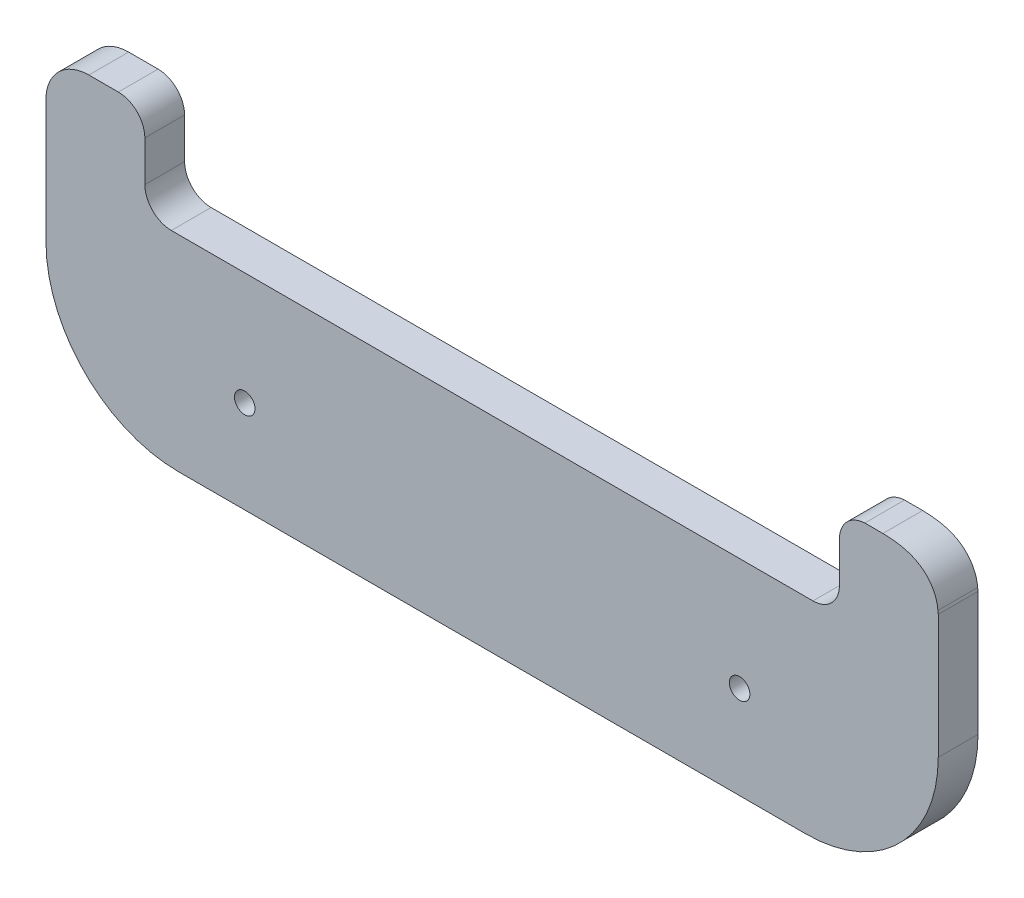
ISO-10303-21;
HEADER;
FILE_DESCRIPTION(('STEP AP214'),'2;1');
FILE_NAME('part.step','',(''),(''),'','','');
FILE_SCHEMA(('AUTOMOTIVE_DESIGN { 1 0 10303 214 1 1 1 1 }'));
ENDSEC;
DATA;
#1=APPLICATION_CONTEXT('core data for automotive mechanical design processes');
#2=APPLICATION_PROTOCOL_DEFINITION('international standard','automotive_design',2000,#1);
#3=PRODUCT_CONTEXT('',#1,'mechanical');
#4=PRODUCT('Part','Part','',(#3));
#5=PRODUCT_RELATED_PRODUCT_CATEGORY('part','',(#4));
#6=PRODUCT_DEFINITION_FORMATION('','',#4);
#7=PRODUCT_DEFINITION_CONTEXT('part definition',#1,'design');
#8=PRODUCT_DEFINITION('design','',#6,#7);
#9=PRODUCT_DEFINITION_SHAPE('','',#8);
#10=(LENGTH_UNIT() NAMED_UNIT(*) SI_UNIT(.MILLI.,.METRE.));
#11=(NAMED_UNIT(*) PLANE_ANGLE_UNIT() SI_UNIT($,.RADIAN.));
#12=(NAMED_UNIT(*) SI_UNIT($,.STERADIAN.) SOLID_ANGLE_UNIT());
#13=UNCERTAINTY_MEASURE_WITH_UNIT(LENGTH_MEASURE(1.E-05),#10,'distance_accuracy_value','');
#14=(GEOMETRIC_REPRESENTATION_CONTEXT(3) GLOBAL_UNCERTAINTY_ASSIGNED_CONTEXT((#13)) GLOBAL_UNIT_ASSIGNED_CONTEXT((#10,
#11,#12)) REPRESENTATION_CONTEXT('',''));
#15=CARTESIAN_POINT('',(0.,0.,0.));
#16=DIRECTION('',(0.,0.,1.));
#17=DIRECTION('',(1.,0.,0.));
#18=AXIS2_PLACEMENT_3D('',#15,#16,#17);
#19=CARTESIAN_POINT('',(559.303105379812,-401.196233577144,6.));
#20=DIRECTION('',(0.,1.,0.));
#21=DIRECTION('',(0.,0.,1.));
#22=AXIS2_PLACEMENT_3D('',#19,#20,#21);
#23=PLANE('',#22);
#24=DIRECTION('',(0.,0.,1.));
#25=VECTOR('',#24,1.);
#26=CARTESIAN_POINT('',(676.433614040021,-401.196233577144,0.));
#27=LINE('',#26,#25);
#28=CARTESIAN_POINT('',(676.433614040021,-401.196233577144,6.));
#29=VERTEX_POINT('',#28);
#30=CARTESIAN_POINT('',(676.433614040021,-401.196233577144,0.));
#31=VERTEX_POINT('',#30);
#32=EDGE_CURVE('E210',#29,#31,#27,.F.);
#33=ORIENTED_EDGE('',*,*,#32,.F.);
#34=DIRECTION('',(1.,0.,0.));
#35=VECTOR('',#34,1.);
#36=CARTESIAN_POINT('',(559.303105379812,-401.196233577144,6.));
#37=LINE('',#36,#35);
#38=CARTESIAN_POINT('',(679.169206808018,-401.196233577143,6.));
#39=VERTEX_POINT('',#38);
#40=EDGE_CURVE('E146',#29,#39,#37,.T.);
#41=ORIENTED_EDGE('',*,*,#40,.T.);
#42=DIRECTION('',(0.,0.,-1.));
#43=VECTOR('',#42,1.);
#44=CARTESIAN_POINT('',(679.169206808018,-401.196233577143,6.));
#45=LINE('',#44,#43);
#46=CARTESIAN_POINT('',(679.169206808018,-401.196233577143,0.));
#47=VERTEX_POINT('',#46);
#48=EDGE_CURVE('E48',#39,#47,#45,.T.);
#49=ORIENTED_EDGE('',*,*,#48,.T.);
#50=DIRECTION('',(1.,0.,0.));
#51=VECTOR('',#50,1.);
#52=CARTESIAN_POINT('',(559.303105379812,-401.196233577144,0.));
#53=LINE('',#52,#51);
#54=EDGE_CURVE('E213',#31,#47,#53,.T.);
#55=ORIENTED_EDGE('',*,*,#54,.F.);
#56=EDGE_LOOP('',(#33,#41,#49,#55));
#57=FACE_BOUND('',#56,.T.);
#58=ADVANCED_FACE('F39',(#57),#23,.T.);
#59=CARTESIAN_POINT('',(687.474491850152,-407.105172622809,6.));
#60=DIRECTION('',(0.994761891683852,0.102219268504351,0.));
#61=DIRECTION('',(-0.102219268504351,0.994761891683852,0.));
#62=AXIS2_PLACEMENT_3D('',#59,#60,#61);
#63=PLANE('',#62);
#64=DIRECTION('',(0.102219268504351,-0.994761891683852,0.));
#65=VECTOR('',#64,1.);
#66=CARTESIAN_POINT('',(687.474491850152,-407.105172622809,0.));
#67=LINE('',#66,#65);
#68=CARTESIAN_POINT('',(687.474491850154,-407.10517262281,0.));
#69=VERTEX_POINT('',#68);
#70=CARTESIAN_POINT('',(687.524115999967,-407.588097357706,0.));
#71=VERTEX_POINT('',#70);
#72=EDGE_CURVE('E165',#69,#71,#67,.T.);
#73=ORIENTED_EDGE('',*,*,#72,.F.);
#74=DIRECTION('',(0.,0.,-1.));
#75=VECTOR('',#74,1.);
#76=CARTESIAN_POINT('',(687.474491850154,-407.10517262281,6.));
#77=LINE('',#76,#75);
#78=CARTESIAN_POINT('',(687.474491850154,-407.10517262281,6.));
#79=VERTEX_POINT('',#78);
#80=EDGE_CURVE('E11',#79,#69,#77,.T.);
#81=ORIENTED_EDGE('',*,*,#80,.F.);
#82=DIRECTION('',(0.102219268504351,-0.994761891683852,0.));
#83=VECTOR('',#82,1.);
#84=CARTESIAN_POINT('',(687.474491850152,-407.105172622809,6.));
#85=LINE('',#84,#83);
#86=CARTESIAN_POINT('',(687.524115999967,-407.588097357706,6.));
#87=VERTEX_POINT('',#86);
#88=EDGE_CURVE('E227',#79,#87,#85,.T.);
#89=ORIENTED_EDGE('',*,*,#88,.T.);
#90=DIRECTION('',(0.,0.,-1.));
#91=VECTOR('',#90,1.);
#92=CARTESIAN_POINT('',(687.524115999967,-407.588097357706,6.));
#93=LINE('',#92,#91);
#94=EDGE_CURVE('E43',#87,#71,#93,.T.);
#95=ORIENTED_EDGE('',*,*,#94,.T.);
#96=EDGE_LOOP('',(#73,#81,#89,#95));
#97=FACE_BOUND('',#96,.T.);
#98=ADVANCED_FACE('F41',(#97),#63,.T.);
#99=CARTESIAN_POINT('',(687.474491850154,-407.10517262281,6.));
#100=CARTESIAN_POINT('',(687.460895427355,-406.945083018139,6.));
#101=CARTESIAN_POINT('',(687.399523084393,-406.440112420926,6.));
#102=CARTESIAN_POINT('',(687.106391165298,-405.247306424066,6.));
#103=CARTESIAN_POINT('',(686.199030086984,-403.667844819503,6.));
#104=CARTESIAN_POINT('',(684.728358654044,-402.453584157924,6.));
#105=CARTESIAN_POINT('',(683.321816890723,-401.804200876229,6.));
#106=CARTESIAN_POINT('',(682.065878556889,-401.467025133511,6.));
#107=CARTESIAN_POINT('',(680.947934353668,-401.299453726585,6.));
#108=CARTESIAN_POINT('',(680.131685922009,-401.236634895549,6.));
#109=CARTESIAN_POINT('',(679.578376244218,-401.210432629164,6.));
#110=CARTESIAN_POINT('',(679.339173947684,-401.201842062767,6.));
#111=CARTESIAN_POINT('',(679.210839256407,-401.197611919618,6.));
#112=CARTESIAN_POINT('',(679.187499025124,-401.196838313689,6.));
#113=CARTESIAN_POINT('',(679.169206808018,-401.196233577143,6.));
#114=B_SPLINE_CURVE_WITH_KNOTS('',3,(#99,#100,#101,#102,#103,#104,#105,#106,#107,#108,#109,#110,
#111,#112,#113),.UNSPECIFIED.,.F.,.F.,(4,1,1,1,1,1,1,1,1,1,1,1,4),(0.0214013834994064,
0.0515441657498783,0.115122873996078,0.242280290488478,0.369437706980877,0.496595123473277,
0.623752539965677,0.750909956458077,0.878067372950476,0.941646081196676,0.990181611322474,
0.996198882570635,1.00522478944288),.UNSPECIFIED.);
#115=DIRECTION('',(0.,0.,-1.));
#116=VECTOR('',#115,1.);
#117=SURFACE_OF_LINEAR_EXTRUSION('',#114,#116);
#118=CARTESIAN_POINT('',(687.474491850154,-407.10517262281,0.));
#119=CARTESIAN_POINT('',(687.460895427355,-406.945083018139,0.));
#120=CARTESIAN_POINT('',(687.399523084393,-406.440112420926,0.));
#121=CARTESIAN_POINT('',(687.106391165298,-405.247306424066,0.));
#122=CARTESIAN_POINT('',(686.199030086984,-403.667844819503,0.));
#123=CARTESIAN_POINT('',(684.728358654044,-402.453584157924,0.));
#124=CARTESIAN_POINT('',(683.321816890723,-401.804200876229,0.));
#125=CARTESIAN_POINT('',(682.065878556889,-401.467025133511,0.));
#126=CARTESIAN_POINT('',(680.947934353668,-401.299453726585,0.));
#127=CARTESIAN_POINT('',(680.131685922009,-401.236634895549,0.));
#128=CARTESIAN_POINT('',(679.578376244218,-401.210432629164,0.));
#129=CARTESIAN_POINT('',(679.339173947684,-401.201842062767,0.));
#130=CARTESIAN_POINT('',(679.210839256407,-401.197611919618,0.));
#131=CARTESIAN_POINT('',(679.187499025124,-401.196838313689,0.));
#132=CARTESIAN_POINT('',(679.169206808018,-401.196233577143,0.));
#133=B_SPLINE_CURVE_WITH_KNOTS('',3,(#118,#119,#120,#121,#122,#123,#124,#125,#126,#127,#128,
#129,#130,#131,#132),.UNSPECIFIED.,.F.,.F.,(4,1,1,1,1,1,1,1,1,1,1,1,4),(0.0214013834994064,
0.0515441657498783,0.115122873996078,0.242280290488478,0.369437706980877,0.496595123473277,
0.623752539965677,0.750909956458077,0.878067372950476,0.941646081196676,0.990181611322474,
0.996198882570635,1.00522478944288),.UNSPECIFIED.);
#134=EDGE_CURVE('E228',#69,#47,#133,.T.);
#135=ORIENTED_EDGE('',*,*,#134,.T.);
#136=ORIENTED_EDGE('',*,*,#48,.F.);
#137=EDGE_CURVE('E156',#79,#39,#114,.T.);
#138=ORIENTED_EDGE('',*,*,#137,.F.);
#139=ORIENTED_EDGE('',*,*,#80,.T.);
#140=EDGE_LOOP('',(#135,#136,#138,#139));
#141=FACE_BOUND('',#140,.T.);
#142=ADVANCED_FACE('F171',(#141),#117,.F.);
#143=DIRECTION('',(0.,0.,1.));
#144=VECTOR('',#143,1.);
#145=CARTESIAN_POINT('',(563.751345179268,-401.196233577155,0.));
#146=LINE('',#145,#144);
#147=CARTESIAN_POINT('',(563.751345179268,-401.196233577155,0.));
#148=VERTEX_POINT('',#147);
#149=CARTESIAN_POINT('',(563.751345179268,-401.196233577155,6.));
#150=VERTEX_POINT('',#149);
#151=EDGE_CURVE('E327',#148,#150,#146,.T.);
#152=ORIENTED_EDGE('',*,*,#151,.F.);
#153=CARTESIAN_POINT('',(559.303105379812,-401.196233577144,0.));
#154=VERTEX_POINT('',#153);
#155=EDGE_CURVE('E135',#154,#148,#53,.T.);
#156=ORIENTED_EDGE('',*,*,#155,.F.);
#157=DIRECTION('',(0.,0.,-1.));
#158=VECTOR('',#157,1.);
#159=CARTESIAN_POINT('',(559.303105379812,-401.196233577144,6.));
#160=LINE('',#159,#158);
#161=CARTESIAN_POINT('',(559.303105379812,-401.196233577144,6.));
#162=VERTEX_POINT('',#161);
#163=EDGE_CURVE('E127',#162,#154,#160,.T.);
#164=ORIENTED_EDGE('',*,*,#163,.F.);
#165=EDGE_CURVE('E133',#162,#150,#37,.T.);
#166=ORIENTED_EDGE('',*,*,#165,.T.);
#167=EDGE_LOOP('',(#152,#156,#164,#166));
#168=FACE_BOUND('',#167,.T.);
#169=ADVANCED_FACE('F130',(#168),#23,.T.);
#170=CARTESIAN_POINT('',(559.303105379812,-407.696233577135,6.));
#171=DIRECTION('',(0.,0.,-1.));
#172=DIRECTION('',(-1.,0.,0.));
#173=AXIS2_PLACEMENT_3D('',#170,#171,#172);
#174=CYLINDRICAL_SURFACE('',#173,6.49999999999158);
#175=CARTESIAN_POINT('',(559.303105379812,-407.696233577135,0.));
#176=DIRECTION('',(0.,0.,1.));
#177=DIRECTION('',(1.,0.,0.));
#178=AXIS2_PLACEMENT_3D('',#175,#176,#177);
#179=CIRCLE('',#178,6.49999999999158);
#180=CARTESIAN_POINT('',(552.82945650884,-407.111536822182,0.));
#181=VERTEX_POINT('',#180);
#182=EDGE_CURVE('E295',#154,#181,#179,.T.);
#183=ORIENTED_EDGE('',*,*,#182,.T.);
#184=DIRECTION('',(0.,0.,-1.));
#185=VECTOR('',#184,1.);
#186=CARTESIAN_POINT('',(552.82945650884,-407.111536822182,6.));
#187=LINE('',#186,#185);
#188=CARTESIAN_POINT('',(552.82945650884,-407.111536822182,6.));
#189=VERTEX_POINT('',#188);
#190=EDGE_CURVE('E139',#189,#181,#187,.T.);
#191=ORIENTED_EDGE('',*,*,#190,.F.);
#192=CARTESIAN_POINT('',(559.303105379812,-407.696233577135,6.));
#193=DIRECTION('',(0.,0.,1.));
#194=DIRECTION('',(1.,0.,0.));
#195=AXIS2_PLACEMENT_3D('',#192,#193,#194);
#196=CIRCLE('',#195,6.49999999999158);
#197=EDGE_CURVE('E143',#162,#189,#196,.T.);
#198=ORIENTED_EDGE('',*,*,#197,.F.);
#199=ORIENTED_EDGE('',*,*,#163,.T.);
#200=EDGE_LOOP('',(#183,#191,#198,#199));
#201=FACE_BOUND('',#200,.T.);
#202=ADVANCED_FACE('F144',(#201),#174,.T.);
#203=CARTESIAN_POINT('',(552.829456508839,-407.696232795402,6.));
#204=DIRECTION('',(-1.,0.,0.));
#205=DIRECTION('',(0.,0.,1.));
#206=AXIS2_PLACEMENT_3D('',#203,#204,#205);
#207=PLANE('',#206);
#208=DIRECTION('',(0.,1.,0.));
#209=VECTOR('',#208,1.);
#210=CARTESIAN_POINT('',(552.829456508839,-407.696232795402,0.));
#211=LINE('',#210,#209);
#212=CARTESIAN_POINT('',(552.829456508839,-426.296181351825,0.));
#213=VERTEX_POINT('',#212);
#214=EDGE_CURVE('E281',#213,#181,#211,.T.);
#215=ORIENTED_EDGE('',*,*,#214,.F.);
#216=DIRECTION('',(0.,0.,-1.));
#217=VECTOR('',#216,1.);
#218=CARTESIAN_POINT('',(552.829456508839,-426.296181351825,6.));
#219=LINE('',#218,#217);
#220=CARTESIAN_POINT('',(552.829456508839,-426.296181351825,6.));
#221=VERTEX_POINT('',#220);
#222=EDGE_CURVE('E233',#221,#213,#219,.T.);
#223=ORIENTED_EDGE('',*,*,#222,.F.);
#224=DIRECTION('',(0.,-1.,0.));
#225=VECTOR('',#224,1.);
#226=CARTESIAN_POINT('',(552.829456508839,-407.696232795402,6.));
#227=LINE('',#226,#225);
#228=EDGE_CURVE('E147',#189,#221,#227,.T.);
#229=ORIENTED_EDGE('',*,*,#228,.F.);
#230=ORIENTED_EDGE('',*,*,#190,.T.);
#231=EDGE_LOOP('',(#215,#223,#229,#230));
#232=FACE_BOUND('',#231,.T.);
#233=ADVANCED_FACE('F181',(#232),#207,.T.);
#234=CARTESIAN_POINT('',(572.829456508839,-426.296179680663,6.));
#235=DIRECTION('',(0.,0.,-1.));
#236=DIRECTION('',(-1.,0.,0.));
#237=AXIS2_PLACEMENT_3D('',#234,#235,#236);
#238=CYLINDRICAL_SURFACE('',#237,20.0000000000001);
#239=CARTESIAN_POINT('',(572.829456508839,-426.296179680663,0.));
#240=DIRECTION('',(0.,0.,1.));
#241=DIRECTION('',(1.,0.,0.));
#242=AXIS2_PLACEMENT_3D('',#239,#240,#241);
#243=CIRCLE('',#242,20.0000000000001);
#244=CARTESIAN_POINT('',(572.829457093747,-446.296179680663,0.));
#245=VERTEX_POINT('',#244);
#246=EDGE_CURVE('E284',#213,#245,#243,.T.);
#247=ORIENTED_EDGE('',*,*,#246,.T.);
#248=DIRECTION('',(0.,0.,-1.));
#249=VECTOR('',#248,1.);
#250=CARTESIAN_POINT('',(572.829457093747,-446.296179680663,6.));
#251=LINE('',#250,#249);
#252=CARTESIAN_POINT('',(572.829457093747,-446.296179680663,6.));
#253=VERTEX_POINT('',#252);
#254=EDGE_CURVE('E236',#253,#245,#251,.T.);
#255=ORIENTED_EDGE('',*,*,#254,.F.);
#256=CARTESIAN_POINT('',(572.829456508839,-426.296179680663,6.));
#257=DIRECTION('',(0.,0.,1.));
#258=DIRECTION('',(1.,0.,0.));
#259=AXIS2_PLACEMENT_3D('',#256,#257,#258);
#260=CIRCLE('',#259,20.0000000000001);
#261=EDGE_CURVE('E274',#221,#253,#260,.T.);
#262=ORIENTED_EDGE('',*,*,#261,.F.);
#263=ORIENTED_EDGE('',*,*,#222,.T.);
#264=EDGE_LOOP('',(#247,#255,#262,#263));
#265=FACE_BOUND('',#264,.T.);
#266=ADVANCED_FACE('F184',(#265),#238,.T.);
#267=CARTESIAN_POINT('',(667.524116584874,-446.296171768155,6.));
#268=DIRECTION('',(8.35581168944906E-08,-0.999999999999996,0.));
#269=DIRECTION('',(0.999999999999997,8.35581168944906E-08,0.));
#270=AXIS2_PLACEMENT_3D('',#267,#268,#269);
#271=PLANE('',#270);
#272=DIRECTION('',(-0.999999999999997,-8.35581168944906E-08,0.));
#273=VECTOR('',#272,1.);
#274=CARTESIAN_POINT('',(667.524116584874,-446.296171768155,0.));
#275=LINE('',#274,#273);
#276=CARTESIAN_POINT('',(667.524116584874,-446.296171768155,0.));
#277=VERTEX_POINT('',#276);
#278=EDGE_CURVE('E288',#277,#245,#275,.T.);
#279=ORIENTED_EDGE('',*,*,#278,.F.);
#280=DIRECTION('',(0.,0.,-1.));
#281=VECTOR('',#280,1.);
#282=CARTESIAN_POINT('',(667.524116584874,-446.296171768155,6.));
#283=LINE('',#282,#281);
#284=CARTESIAN_POINT('',(667.524116584874,-446.296171768155,6.));
#285=VERTEX_POINT('',#284);
#286=EDGE_CURVE('E239',#285,#277,#283,.T.);
#287=ORIENTED_EDGE('',*,*,#286,.F.);
#288=DIRECTION('',(-0.999999999999997,-8.35581168944906E-08,0.));
#289=VECTOR('',#288,1.);
#290=CARTESIAN_POINT('',(667.524116584874,-446.296171768155,6.));
#291=LINE('',#290,#289);
#292=EDGE_CURVE('E270',#285,#253,#291,.T.);
#293=ORIENTED_EDGE('',*,*,#292,.T.);
#294=ORIENTED_EDGE('',*,*,#254,.T.);
#295=EDGE_LOOP('',(#279,#287,#293,#294));
#296=FACE_BOUND('',#295,.T.);
#297=ADVANCED_FACE('F188',(#296),#271,.T.);
#298=CARTESIAN_POINT('',(667.524114328805,-426.296170096993,6.));
#299=DIRECTION('',(0.,0.,-1.));
#300=DIRECTION('',(-1.,0.,0.));
#301=AXIS2_PLACEMENT_3D('',#298,#299,#300);
#302=CYLINDRICAL_SURFACE('',#301,20.0000016711625);
#303=CARTESIAN_POINT('',(667.524114328805,-426.296170096993,0.));
#304=DIRECTION('',(0.,0.,1.));
#305=DIRECTION('',(1.,0.,0.));
#306=AXIS2_PLACEMENT_3D('',#303,#304,#305);
#307=CIRCLE('',#306,20.0000016711625);
#308=CARTESIAN_POINT('',(687.524115999967,-426.296170096993,0.));
#309=VERTEX_POINT('',#308);
#310=EDGE_CURVE('E250',#277,#309,#307,.T.);
#311=ORIENTED_EDGE('',*,*,#310,.T.);
#312=DIRECTION('',(0.,0.,-1.));
#313=VECTOR('',#312,1.);
#314=CARTESIAN_POINT('',(687.524115999967,-426.296170096993,6.));
#315=LINE('',#314,#313);
#316=CARTESIAN_POINT('',(687.524115999967,-426.296170096993,6.));
#317=VERTEX_POINT('',#316);
#318=EDGE_CURVE('E240',#317,#309,#315,.T.);
#319=ORIENTED_EDGE('',*,*,#318,.F.);
#320=CARTESIAN_POINT('',(667.524114328805,-426.296170096993,6.));
#321=DIRECTION('',(0.,0.,1.));
#322=DIRECTION('',(1.,0.,0.));
#323=AXIS2_PLACEMENT_3D('',#320,#321,#322);
#324=CIRCLE('',#323,20.0000016711625);
#325=EDGE_CURVE('E267',#285,#317,#324,.T.);
#326=ORIENTED_EDGE('',*,*,#325,.F.);
#327=ORIENTED_EDGE('',*,*,#286,.T.);
#328=EDGE_LOOP('',(#311,#319,#326,#327));
#329=FACE_BOUND('',#328,.T.);
#330=ADVANCED_FACE('F192',(#329),#302,.T.);
#331=CARTESIAN_POINT('',(687.524115999967,-419.296173358669,6.));
#332=DIRECTION('',(1.,0.,0.));
#333=DIRECTION('',(0.,0.,-1.));
#334=AXIS2_PLACEMENT_3D('',#331,#332,#333);
#335=PLANE('',#334);
#336=DIRECTION('',(0.,-1.,0.));
#337=VECTOR('',#336,1.);
#338=CARTESIAN_POINT('',(687.524115999967,-419.296173358669,0.));
#339=LINE('',#338,#337);
#340=EDGE_CURVE('E248',#71,#309,#339,.T.);
#341=ORIENTED_EDGE('',*,*,#340,.F.);
#342=ORIENTED_EDGE('',*,*,#94,.F.);
#343=DIRECTION('',(0.,-1.,0.));
#344=VECTOR('',#343,1.);
#345=CARTESIAN_POINT('',(687.524115999967,-407.588097357706,6.));
#346=LINE('',#345,#344);
#347=EDGE_CURVE('E265',#87,#317,#346,.T.);
#348=ORIENTED_EDGE('',*,*,#347,.T.);
#349=ORIENTED_EDGE('',*,*,#318,.T.);
#350=EDGE_LOOP('',(#341,#342,#348,#349));
#351=FACE_BOUND('',#350,.T.);
#352=ADVANCED_FACE('F195',(#351),#335,.T.);
#353=CARTESIAN_POINT('',(667.524114328805,-426.296170096993,6.));
#354=DIRECTION('',(0.,0.,1.));
#355=DIRECTION('',(1.,0.,0.));
#356=AXIS2_PLACEMENT_3D('',#353,#354,#355);
#357=PLANE('',#356);
#358=CARTESIAN_POINT('',(676.604115999967,-405.192598060228,6.));
#359=DIRECTION('',(0.,0.,-1.));
#360=DIRECTION('',(1.,0.,0.));
#361=AXIS2_PLACEMENT_3D('',#358,#359,#360);
#362=CIRCLE('',#361,4.00000000000002);
#363=CARTESIAN_POINT('',(672.604115999967,-405.192598060228,6.));
#364=VERTEX_POINT('',#363);
#365=EDGE_CURVE('E224',#364,#29,#362,.T.);
#366=ORIENTED_EDGE('',*,*,#365,.F.);
#367=DIRECTION('',(0.,1.,0.));
#368=VECTOR('',#367,1.);
#369=CARTESIAN_POINT('',(672.604115999967,-411.296173180502,6.));
#370=LINE('',#369,#368);
#371=CARTESIAN_POINT('',(672.604115999967,-411.296173180502,6.));
#372=VERTEX_POINT('',#371);
#373=EDGE_CURVE('E310',#372,#364,#370,.T.);
#374=ORIENTED_EDGE('',*,*,#373,.F.);
#375=CARTESIAN_POINT('',(668.604115999967,-411.296173180502,6.));
#376=DIRECTION('',(0.,0.,1.));
#377=DIRECTION('',(1.,0.,0.));
#378=AXIS2_PLACEMENT_3D('',#375,#376,#377);
#379=CIRCLE('',#378,4.);
#380=CARTESIAN_POINT('',(668.604115999969,-415.296173180502,6.));
#381=VERTEX_POINT('',#380);
#382=EDGE_CURVE('E314',#381,#372,#379,.T.);
#383=ORIENTED_EDGE('',*,*,#382,.F.);
#384=DIRECTION('',(1.,0.,0.));
#385=VECTOR('',#384,1.);
#386=CARTESIAN_POINT('',(668.604115999969,-415.296173180502,6.));
#387=LINE('',#386,#385);
#388=CARTESIAN_POINT('',(571.75134517927,-415.296173180502,6.));
#389=VERTEX_POINT('',#388);
#390=EDGE_CURVE('E336',#389,#381,#387,.T.);
#391=ORIENTED_EDGE('',*,*,#390,.F.);
#392=CARTESIAN_POINT('',(571.751345179269,-411.296173180502,6.));
#393=DIRECTION('',(0.,0.,1.));
#394=DIRECTION('',(-1.,0.,0.));
#395=AXIS2_PLACEMENT_3D('',#392,#393,#394);
#396=CIRCLE('',#395,4.);
#397=CARTESIAN_POINT('',(567.751345179269,-411.296173180503,6.));
#398=VERTEX_POINT('',#397);
#399=EDGE_CURVE('E333',#398,#389,#396,.T.);
#400=ORIENTED_EDGE('',*,*,#399,.F.);
#401=DIRECTION('',(1.09203345949429E-13,-1.,0.));
#402=VECTOR('',#401,1.);
#403=CARTESIAN_POINT('',(567.751345179269,-411.296173180503,6.));
#404=LINE('',#403,#402);
#405=CARTESIAN_POINT('',(567.751345179269,-405.196233577154,6.));
#406=VERTEX_POINT('',#405);
#407=EDGE_CURVE('E330',#406,#398,#404,.T.);
#408=ORIENTED_EDGE('',*,*,#407,.F.);
#409=CARTESIAN_POINT('',(563.751345179269,-405.196233577155,6.));
#410=DIRECTION('',(0.,0.,-1.));
#411=DIRECTION('',(-1.,0.,0.));
#412=AXIS2_PLACEMENT_3D('',#409,#410,#411);
#413=CIRCLE('',#412,4.);
#414=EDGE_CURVE('E155',#150,#406,#413,.T.);
#415=ORIENTED_EDGE('',*,*,#414,.F.);
#416=ORIENTED_EDGE('',*,*,#165,.F.);
#417=ORIENTED_EDGE('',*,*,#197,.T.);
#418=ORIENTED_EDGE('',*,*,#228,.T.);
#419=ORIENTED_EDGE('',*,*,#261,.T.);
#420=ORIENTED_EDGE('',*,*,#292,.F.);
#421=ORIENTED_EDGE('',*,*,#325,.T.);
#422=ORIENTED_EDGE('',*,*,#347,.F.);
#423=ORIENTED_EDGE('',*,*,#88,.F.);
#424=ORIENTED_EDGE('',*,*,#137,.T.);
#425=ORIENTED_EDGE('',*,*,#40,.F.);
#426=EDGE_LOOP('',(#366,#374,#383,#391,#400,#408,#415,#416,#417,#418,#419,#420,#421,#422,#423,
#424,#425));
#427=FACE_BOUND('',#426,.T.);
#428=CARTESIAN_POINT('',(657.534304884215,-432.275447832236,6.));
#429=DIRECTION('',(0.,0.,1.));
#430=DIRECTION('',(1.,0.,0.));
#431=AXIS2_PLACEMENT_3D('',#428,#429,#430);
#432=CIRCLE('',#431,1.54999999999953);
#433=CARTESIAN_POINT('',(659.084304884214,-432.275447832236,6.));
#434=VERTEX_POINT('',#433);
#435=EDGE_CURVE('E219',#434,#434,#432,.T.);
#436=ORIENTED_EDGE('',*,*,#435,.F.);
#437=EDGE_LOOP('',(#436));
#438=FACE_BOUND('',#437,.T.);
#439=CARTESIAN_POINT('',(582.829456508839,-432.296173587923,6.));
#440=DIRECTION('',(0.,0.,1.));
#441=DIRECTION('',(1.,0.,0.));
#442=AXIS2_PLACEMENT_3D('',#439,#440,#441);
#443=CIRCLE('',#442,1.54999999999907);
#444=CARTESIAN_POINT('',(584.379456508838,-432.296173587923,6.));
#445=VERTEX_POINT('',#444);
#446=EDGE_CURVE('E253',#445,#445,#443,.T.);
#447=ORIENTED_EDGE('',*,*,#446,.F.);
#448=EDGE_LOOP('',(#447));
#449=FACE_BOUND('',#448,.T.);
#450=ADVANCED_FACE('F151',(#427,#438,#449),#357,.T.);
#451=CARTESIAN_POINT('',(667.524114328805,-426.296170096993,0.));
#452=DIRECTION('',(0.,0.,1.));
#453=DIRECTION('',(1.,0.,0.));
#454=AXIS2_PLACEMENT_3D('',#451,#452,#453);
#455=PLANE('',#454);
#456=CARTESIAN_POINT('',(657.534304884215,-432.275447832236,0.));
#457=DIRECTION('',(0.,0.,1.));
#458=DIRECTION('',(1.,0.,0.));
#459=AXIS2_PLACEMENT_3D('',#456,#457,#458);
#460=CIRCLE('',#459,1.54999999999953);
#461=CARTESIAN_POINT('',(659.084304884214,-432.275447832236,0.));
#462=VERTEX_POINT('',#461);
#463=EDGE_CURVE('E259',#462,#462,#460,.T.);
#464=ORIENTED_EDGE('',*,*,#463,.T.);
#465=EDGE_LOOP('',(#464));
#466=FACE_BOUND('',#465,.T.);
#467=CARTESIAN_POINT('',(582.829456508839,-432.296173587923,0.));
#468=DIRECTION('',(0.,0.,1.));
#469=DIRECTION('',(1.,0.,0.));
#470=AXIS2_PLACEMENT_3D('',#467,#468,#469);
#471=CIRCLE('',#470,1.54999999999907);
#472=CARTESIAN_POINT('',(584.379456508838,-432.296173587923,0.));
#473=VERTEX_POINT('',#472);
#474=EDGE_CURVE('E249',#473,#473,#471,.T.);
#475=ORIENTED_EDGE('',*,*,#474,.T.);
#476=EDGE_LOOP('',(#475));
#477=FACE_BOUND('',#476,.T.);
#478=DIRECTION('',(0.,1.,0.));
#479=VECTOR('',#478,1.);
#480=CARTESIAN_POINT('',(672.604115999967,-411.296173180502,0.));
#481=LINE('',#480,#479);
#482=CARTESIAN_POINT('',(672.604115999967,-411.296173180502,0.));
#483=VERTEX_POINT('',#482);
#484=CARTESIAN_POINT('',(672.604115999967,-405.192598060228,0.));
#485=VERTEX_POINT('',#484);
#486=EDGE_CURVE('E307',#483,#485,#481,.T.);
#487=ORIENTED_EDGE('',*,*,#486,.T.);
#488=CARTESIAN_POINT('',(676.604115999967,-405.192598060228,0.));
#489=DIRECTION('',(0.,0.,-1.));
#490=DIRECTION('',(1.,0.,0.));
#491=AXIS2_PLACEMENT_3D('',#488,#489,#490);
#492=CIRCLE('',#491,4.00000000000002);
#493=EDGE_CURVE('E304',#485,#31,#492,.T.);
#494=ORIENTED_EDGE('',*,*,#493,.T.);
#495=ORIENTED_EDGE('',*,*,#54,.T.);
#496=ORIENTED_EDGE('',*,*,#134,.F.);
#497=ORIENTED_EDGE('',*,*,#72,.T.);
#498=ORIENTED_EDGE('',*,*,#340,.T.);
#499=ORIENTED_EDGE('',*,*,#310,.F.);
#500=ORIENTED_EDGE('',*,*,#278,.T.);
#501=ORIENTED_EDGE('',*,*,#246,.F.);
#502=ORIENTED_EDGE('',*,*,#214,.T.);
#503=ORIENTED_EDGE('',*,*,#182,.F.);
#504=ORIENTED_EDGE('',*,*,#155,.T.);
#505=CARTESIAN_POINT('',(563.751345179269,-405.196233577155,0.));
#506=DIRECTION('',(0.,0.,-1.));
#507=DIRECTION('',(-1.,0.,0.));
#508=AXIS2_PLACEMENT_3D('',#505,#506,#507);
#509=CIRCLE('',#508,4.);
#510=CARTESIAN_POINT('',(567.751345179269,-405.196233577155,0.));
#511=VERTEX_POINT('',#510);
#512=EDGE_CURVE('E309',#148,#511,#509,.T.);
#513=ORIENTED_EDGE('',*,*,#512,.T.);
#514=DIRECTION('',(1.09203345949429E-13,-1.,0.));
#515=VECTOR('',#514,1.);
#516=CARTESIAN_POINT('',(567.751345179269,-411.296173180503,0.));
#517=LINE('',#516,#515);
#518=CARTESIAN_POINT('',(567.751345179269,-411.296173180503,0.));
#519=VERTEX_POINT('',#518);
#520=EDGE_CURVE('E56',#511,#519,#517,.T.);
#521=ORIENTED_EDGE('',*,*,#520,.T.);
#522=CARTESIAN_POINT('',(571.751345179269,-411.296173180502,0.));
#523=DIRECTION('',(0.,0.,1.));
#524=DIRECTION('',(-1.,0.,0.));
#525=AXIS2_PLACEMENT_3D('',#522,#523,#524);
#526=CIRCLE('',#525,4.);
#527=CARTESIAN_POINT('',(571.75134517927,-415.296173180502,0.));
#528=VERTEX_POINT('',#527);
#529=EDGE_CURVE('E318',#519,#528,#526,.T.);
#530=ORIENTED_EDGE('',*,*,#529,.T.);
#531=DIRECTION('',(1.,0.,0.));
#532=VECTOR('',#531,1.);
#533=CARTESIAN_POINT('',(668.604115999969,-415.296173180502,0.));
#534=LINE('',#533,#532);
#535=CARTESIAN_POINT('',(668.604115999969,-415.296173180502,0.));
#536=VERTEX_POINT('',#535);
#537=EDGE_CURVE('E321',#528,#536,#534,.T.);
#538=ORIENTED_EDGE('',*,*,#537,.T.);
#539=CARTESIAN_POINT('',(668.604115999967,-411.296173180502,0.));
#540=DIRECTION('',(0.,0.,1.));
#541=DIRECTION('',(1.,0.,0.));
#542=AXIS2_PLACEMENT_3D('',#539,#540,#541);
#543=CIRCLE('',#542,4.);
#544=EDGE_CURVE('E324',#536,#483,#543,.T.);
#545=ORIENTED_EDGE('',*,*,#544,.T.);
#546=EDGE_LOOP('',(#487,#494,#495,#496,#497,#498,#499,#500,#501,#502,#503,#504,#513,#521,#530,
#538,#545));
#547=FACE_BOUND('',#546,.T.);
#548=ADVANCED_FACE('F175',(#466,#477,#547),#455,.F.);
#549=CARTESIAN_POINT('',(582.829456508839,-432.296173587923,0.));
#550=DIRECTION('',(0.,0.,1.));
#551=DIRECTION('',(1.,0.,0.));
#552=AXIS2_PLACEMENT_3D('',#549,#550,#551);
#553=CYLINDRICAL_SURFACE('',#552,1.54999999999907);
#554=ORIENTED_EDGE('',*,*,#474,.F.);
#555=EDGE_LOOP('',(#554));
#556=FACE_BOUND('',#555,.T.);
#557=ORIENTED_EDGE('',*,*,#446,.T.);
#558=EDGE_LOOP('',(#557));
#559=FACE_BOUND('',#558,.T.);
#560=ADVANCED_FACE('F367',(#556,#559),#553,.F.);
#561=CARTESIAN_POINT('',(657.534304884215,-432.275447832236,0.));
#562=DIRECTION('',(0.,0.,1.));
#563=DIRECTION('',(1.,0.,0.));
#564=AXIS2_PLACEMENT_3D('',#561,#562,#563);
#565=CYLINDRICAL_SURFACE('',#564,1.54999999999953);
#566=ORIENTED_EDGE('',*,*,#463,.F.);
#567=EDGE_LOOP('',(#566));
#568=FACE_BOUND('',#567,.T.);
#569=ORIENTED_EDGE('',*,*,#435,.T.);
#570=EDGE_LOOP('',(#569));
#571=FACE_BOUND('',#570,.T.);
#572=ADVANCED_FACE('F363',(#568,#571),#565,.F.);
#573=CARTESIAN_POINT('',(676.604115999967,-405.192598060228,0.));
#574=DIRECTION('',(0.,0.,1.));
#575=DIRECTION('',(1.,0.,0.));
#576=AXIS2_PLACEMENT_3D('',#573,#574,#575);
#577=CYLINDRICAL_SURFACE('',#576,4.00000000000002);
#578=ORIENTED_EDGE('',*,*,#32,.T.);
#579=ORIENTED_EDGE('',*,*,#493,.F.);
#580=DIRECTION('',(0.,0.,1.));
#581=VECTOR('',#580,1.);
#582=CARTESIAN_POINT('',(672.604115999967,-405.192598060228,0.));
#583=LINE('',#582,#581);
#584=EDGE_CURVE('E220',#485,#364,#583,.T.);
#585=ORIENTED_EDGE('',*,*,#584,.T.);
#586=ORIENTED_EDGE('',*,*,#365,.T.);
#587=EDGE_LOOP('',(#578,#579,#585,#586));
#588=FACE_BOUND('',#587,.T.);
#589=ADVANCED_FACE('F375',(#588),#577,.T.);
#590=CARTESIAN_POINT('',(672.604115999967,-411.296173180502,0.));
#591=DIRECTION('',(1.,0.,0.));
#592=DIRECTION('',(0.,0.,-1.));
#593=AXIS2_PLACEMENT_3D('',#590,#591,#592);
#594=PLANE('',#593);
#595=ORIENTED_EDGE('',*,*,#373,.T.);
#596=ORIENTED_EDGE('',*,*,#584,.F.);
#597=ORIENTED_EDGE('',*,*,#486,.F.);
#598=DIRECTION('',(0.,0.,1.));
#599=VECTOR('',#598,1.);
#600=CARTESIAN_POINT('',(672.604115999967,-411.296173180502,0.));
#601=LINE('',#600,#599);
#602=EDGE_CURVE('E342',#483,#372,#601,.T.);
#603=ORIENTED_EDGE('',*,*,#602,.T.);
#604=EDGE_LOOP('',(#595,#596,#597,#603));
#605=FACE_BOUND('',#604,.T.);
#606=ADVANCED_FACE('F381',(#605),#594,.F.);
#607=CARTESIAN_POINT('',(668.604115999967,-411.296173180502,0.));
#608=DIRECTION('',(0.,0.,1.));
#609=DIRECTION('',(1.,0.,0.));
#610=AXIS2_PLACEMENT_3D('',#607,#608,#609);
#611=CYLINDRICAL_SURFACE('',#610,4.);
#612=ORIENTED_EDGE('',*,*,#382,.T.);
#613=ORIENTED_EDGE('',*,*,#602,.F.);
#614=ORIENTED_EDGE('',*,*,#544,.F.);
#615=DIRECTION('',(0.,0.,1.));
#616=VECTOR('',#615,1.);
#617=CARTESIAN_POINT('',(668.604115999969,-415.296173180502,0.));
#618=LINE('',#617,#616);
#619=EDGE_CURVE('E345',#536,#381,#618,.T.);
#620=ORIENTED_EDGE('',*,*,#619,.T.);
#621=EDGE_LOOP('',(#612,#613,#614,#620));
#622=FACE_BOUND('',#621,.T.);
#623=ADVANCED_FACE('F396',(#622),#611,.F.);
#624=CARTESIAN_POINT('',(668.604115999969,-415.296173180502,0.));
#625=DIRECTION('',(0.,-1.,0.));
#626=DIRECTION('',(1.,0.,0.));
#627=AXIS2_PLACEMENT_3D('',#624,#625,#626);
#628=PLANE('',#627);
#629=ORIENTED_EDGE('',*,*,#390,.T.);
#630=ORIENTED_EDGE('',*,*,#619,.F.);
#631=ORIENTED_EDGE('',*,*,#537,.F.);
#632=DIRECTION('',(0.,0.,1.));
#633=VECTOR('',#632,1.);
#634=CARTESIAN_POINT('',(571.75134517927,-415.296173180502,0.));
#635=LINE('',#634,#633);
#636=EDGE_CURVE('E348',#528,#389,#635,.T.);
#637=ORIENTED_EDGE('',*,*,#636,.T.);
#638=EDGE_LOOP('',(#629,#630,#631,#637));
#639=FACE_BOUND('',#638,.T.);
#640=ADVANCED_FACE('F392',(#639),#628,.F.);
#641=CARTESIAN_POINT('',(571.751345179269,-411.296173180502,0.));
#642=DIRECTION('',(0.,0.,1.));
#643=DIRECTION('',(1.,0.,0.));
#644=AXIS2_PLACEMENT_3D('',#641,#642,#643);
#645=CYLINDRICAL_SURFACE('',#644,4.);
#646=ORIENTED_EDGE('',*,*,#399,.T.);
#647=ORIENTED_EDGE('',*,*,#636,.F.);
#648=ORIENTED_EDGE('',*,*,#529,.F.);
#649=DIRECTION('',(0.,0.,1.));
#650=VECTOR('',#649,1.);
#651=CARTESIAN_POINT('',(567.751345179269,-411.296173180503,0.));
#652=LINE('',#651,#650);
#653=EDGE_CURVE('E351',#519,#398,#652,.T.);
#654=ORIENTED_EDGE('',*,*,#653,.T.);
#655=EDGE_LOOP('',(#646,#647,#648,#654));
#656=FACE_BOUND('',#655,.T.);
#657=ADVANCED_FACE('F389',(#656),#645,.F.);
#658=CARTESIAN_POINT('',(567.751345179269,-411.296173180503,0.));
#659=DIRECTION('',(-1.,-1.09203345949429E-13,0.));
#660=DIRECTION('',(1.09203345949429E-13,-1.,0.));
#661=AXIS2_PLACEMENT_3D('',#658,#659,#660);
#662=PLANE('',#661);
#663=ORIENTED_EDGE('',*,*,#407,.T.);
#664=ORIENTED_EDGE('',*,*,#653,.F.);
#665=ORIENTED_EDGE('',*,*,#520,.F.);
#666=DIRECTION('',(0.,0.,1.));
#667=VECTOR('',#666,1.);
#668=CARTESIAN_POINT('',(567.751345179269,-405.196233577154,0.));
#669=LINE('',#668,#667);
#670=EDGE_CURVE('E354',#511,#406,#669,.T.);
#671=ORIENTED_EDGE('',*,*,#670,.T.);
#672=EDGE_LOOP('',(#663,#664,#665,#671));
#673=FACE_BOUND('',#672,.T.);
#674=ADVANCED_FACE('F385',(#673),#662,.F.);
#675=CARTESIAN_POINT('',(563.751345179269,-405.196233577155,0.));
#676=DIRECTION('',(0.,0.,1.));
#677=DIRECTION('',(1.,0.,0.));
#678=AXIS2_PLACEMENT_3D('',#675,#676,#677);
#679=CYLINDRICAL_SURFACE('',#678,4.);
#680=ORIENTED_EDGE('',*,*,#414,.T.);
#681=ORIENTED_EDGE('',*,*,#670,.F.);
#682=ORIENTED_EDGE('',*,*,#512,.F.);
#683=ORIENTED_EDGE('',*,*,#151,.T.);
#684=EDGE_LOOP('',(#680,#681,#682,#683));
#685=FACE_BOUND('',#684,.T.);
#686=ADVANCED_FACE('F382',(#685),#679,.T.);
#687=CLOSED_SHELL('',(#58,#98,#142,#169,#202,#233,#266,#297,#330,#352,#450,#548,#560,#572,#589,
#606,#623,#640,#657,#674,#686));
#688=MANIFOLD_SOLID_BREP('B2',#687);
#689=ADVANCED_BREP_SHAPE_REPRESENTATION('',(#18,#688),#14);
#690=SHAPE_DEFINITION_REPRESENTATION(#9,#689);
ENDSEC;
END-ISO-10303-21;
